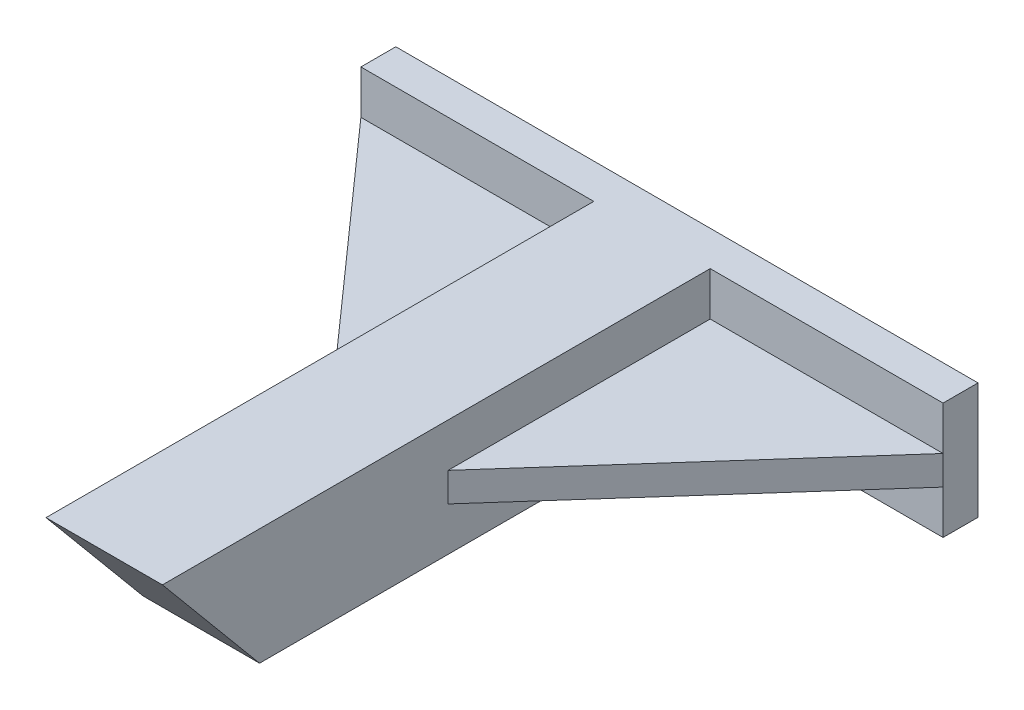
ISO-10303-21;
HEADER;
FILE_DESCRIPTION(('STEP AP214'),'2;1');
FILE_NAME('part.step','',(''),(''),'','','');
FILE_SCHEMA(('AUTOMOTIVE_DESIGN { 1 0 10303 214 1 1 1 1 }'));
ENDSEC;
DATA;
#1=APPLICATION_CONTEXT('core data for automotive mechanical design processes');
#2=APPLICATION_PROTOCOL_DEFINITION('international standard','automotive_design',2000,#1);
#3=PRODUCT_CONTEXT('',#1,'mechanical');
#4=PRODUCT('Part','Part','',(#3));
#5=PRODUCT_RELATED_PRODUCT_CATEGORY('part','',(#4));
#6=PRODUCT_DEFINITION_FORMATION('','',#4);
#7=PRODUCT_DEFINITION_CONTEXT('part definition',#1,'design');
#8=PRODUCT_DEFINITION('design','',#6,#7);
#9=PRODUCT_DEFINITION_SHAPE('','',#8);
#10=(LENGTH_UNIT() NAMED_UNIT(*) SI_UNIT(.MILLI.,.METRE.));
#11=(NAMED_UNIT(*) PLANE_ANGLE_UNIT() SI_UNIT($,.RADIAN.));
#12=(NAMED_UNIT(*) SI_UNIT($,.STERADIAN.) SOLID_ANGLE_UNIT());
#13=UNCERTAINTY_MEASURE_WITH_UNIT(LENGTH_MEASURE(1.E-05),#10,'distance_accuracy_value','');
#14=(GEOMETRIC_REPRESENTATION_CONTEXT(3) GLOBAL_UNCERTAINTY_ASSIGNED_CONTEXT((#13)) GLOBAL_UNIT_ASSIGNED_CONTEXT((#10,
#11,#12)) REPRESENTATION_CONTEXT('',''));
#15=CARTESIAN_POINT('',(0.,0.,0.));
#16=DIRECTION('',(0.,0.,1.));
#17=DIRECTION('',(1.,0.,0.));
#18=AXIS2_PLACEMENT_3D('',#15,#16,#17);
#19=CARTESIAN_POINT('',(-40.,100.,81.));
#20=DIRECTION('',(0.,0.,1.));
#21=DIRECTION('',(1.,0.,0.));
#22=AXIS2_PLACEMENT_3D('',#19,#20,#21);
#23=PLANE('',#22);
#24=DIRECTION('',(0.,1.,0.));
#25=VECTOR('',#24,1.);
#26=CARTESIAN_POINT('',(0.,0.,81.));
#27=LINE('',#26,#25);
#28=CARTESIAN_POINT('',(0.,100.,81.));
#29=VERTEX_POINT('',#28);
#30=CARTESIAN_POINT('',(0.,107.5,81.));
#31=VERTEX_POINT('',#30);
#32=EDGE_CURVE('E11',#29,#31,#27,.T.);
#33=ORIENTED_EDGE('',*,*,#32,.T.);
#34=DIRECTION('',(-1.,0.,0.));
#35=VECTOR('',#34,1.);
#36=CARTESIAN_POINT('',(60.,107.5,81.));
#37=LINE('',#36,#35);
#38=CARTESIAN_POINT('',(-40.,107.5,81.));
#39=VERTEX_POINT('',#38);
#40=EDGE_CURVE('E252',#31,#39,#37,.T.);
#41=ORIENTED_EDGE('',*,*,#40,.T.);
#42=DIRECTION('',(0.,1.,0.));
#43=VECTOR('',#42,1.);
#44=CARTESIAN_POINT('',(-40.,100.,81.));
#45=LINE('',#44,#43);
#46=CARTESIAN_POINT('',(-40.,100.,81.));
#47=VERTEX_POINT('',#46);
#48=EDGE_CURVE('E169',#47,#39,#45,.T.);
#49=ORIENTED_EDGE('',*,*,#48,.F.);
#50=DIRECTION('',(1.,0.,0.));
#51=VECTOR('',#50,1.);
#52=CARTESIAN_POINT('',(-40.,100.,81.));
#53=LINE('',#52,#51);
#54=EDGE_CURVE('E191',#47,#29,#53,.T.);
#55=ORIENTED_EDGE('',*,*,#54,.T.);
#56=EDGE_LOOP('',(#33,#41,#49,#55));
#57=FACE_BOUND('',#56,.T.);
#58=ADVANCED_FACE('F39',(#57),#23,.T.);
#59=DIRECTION('',(0.,1.,0.));
#60=VECTOR('',#59,1.);
#61=CARTESIAN_POINT('',(60.,100.,81.));
#62=LINE('',#61,#60);
#63=CARTESIAN_POINT('',(60.,100.,81.));
#64=VERTEX_POINT('',#63);
#65=CARTESIAN_POINT('',(60.,107.5,81.));
#66=VERTEX_POINT('',#65);
#67=EDGE_CURVE('E208',#64,#66,#62,.T.);
#68=ORIENTED_EDGE('',*,*,#67,.T.);
#69=CARTESIAN_POINT('',(20.,107.5,81.));
#70=VERTEX_POINT('',#69);
#71=EDGE_CURVE('E269',#66,#70,#37,.T.);
#72=ORIENTED_EDGE('',*,*,#71,.T.);
#73=DIRECTION('',(0.,1.,0.));
#74=VECTOR('',#73,1.);
#75=CARTESIAN_POINT('',(20.,0.,81.));
#76=LINE('',#75,#74);
#77=CARTESIAN_POINT('',(20.,100.,81.));
#78=VERTEX_POINT('',#77);
#79=EDGE_CURVE('E212',#78,#70,#76,.T.);
#80=ORIENTED_EDGE('',*,*,#79,.F.);
#81=EDGE_CURVE('E189',#78,#64,#53,.T.);
#82=ORIENTED_EDGE('',*,*,#81,.T.);
#83=EDGE_LOOP('',(#68,#72,#80,#82));
#84=FACE_BOUND('',#83,.T.);
#85=ADVANCED_FACE('F267',(#84),#23,.T.);
#86=CARTESIAN_POINT('',(20.,100.,74.9999999999999));
#87=DIRECTION('',(0.,-1.,0.));
#88=DIRECTION('',(0.,0.,-1.));
#89=AXIS2_PLACEMENT_3D('',#86,#87,#88);
#90=PLANE('',#89);
#91=DIRECTION('',(0.,0.,1.));
#92=VECTOR('',#91,1.);
#93=CARTESIAN_POINT('',(0.,100.,74.9999999999999));
#94=LINE('',#93,#92);
#95=CARTESIAN_POINT('',(0.,100.,158.405049837057));
#96=VERTEX_POINT('',#95);
#97=EDGE_CURVE('E214',#29,#96,#94,.T.);
#98=ORIENTED_EDGE('',*,*,#97,.F.);
#99=ORIENTED_EDGE('',*,*,#54,.F.);
#100=DIRECTION('',(0.,0.,1.));
#101=VECTOR('',#100,1.);
#102=CARTESIAN_POINT('',(-40.,100.,75.));
#103=LINE('',#102,#101);
#104=CARTESIAN_POINT('',(-40.,100.,75.));
#105=VERTEX_POINT('',#104);
#106=EDGE_CURVE('E187',#105,#47,#103,.T.);
#107=ORIENTED_EDGE('',*,*,#106,.F.);
#108=DIRECTION('',(-1.,0.,0.));
#109=VECTOR('',#108,1.);
#110=CARTESIAN_POINT('',(20.,100.,74.9999999999999));
#111=LINE('',#110,#109);
#112=CARTESIAN_POINT('',(60.,100.,75.));
#113=VERTEX_POINT('',#112);
#114=EDGE_CURVE('E231',#113,#105,#111,.T.);
#115=ORIENTED_EDGE('',*,*,#114,.F.);
#116=DIRECTION('',(0.,0.,-1.));
#117=VECTOR('',#116,1.);
#118=CARTESIAN_POINT('',(60.,100.,75.));
#119=LINE('',#118,#117);
#120=EDGE_CURVE('E170',#64,#113,#119,.T.);
#121=ORIENTED_EDGE('',*,*,#120,.F.);
#122=ORIENTED_EDGE('',*,*,#81,.F.);
#123=DIRECTION('',(0.,0.,1.));
#124=VECTOR('',#123,1.);
#125=CARTESIAN_POINT('',(20.,100.,74.9999999999999));
#126=LINE('',#125,#124);
#127=CARTESIAN_POINT('',(20.,100.,158.405049837057));
#128=VERTEX_POINT('',#127);
#129=EDGE_CURVE('E215',#78,#128,#126,.T.);
#130=ORIENTED_EDGE('',*,*,#129,.T.);
#131=DIRECTION('',(-1.,0.,0.));
#132=VECTOR('',#131,1.);
#133=CARTESIAN_POINT('',(20.,100.,158.405049837057));
#134=LINE('',#133,#132);
#135=EDGE_CURVE('E224',#128,#96,#134,.T.);
#136=ORIENTED_EDGE('',*,*,#135,.T.);
#137=EDGE_LOOP('',(#98,#99,#107,#115,#121,#122,#130,#136));
#138=FACE_BOUND('',#137,.T.);
#139=ADVANCED_FACE('F41',(#138),#90,.T.);
#140=CARTESIAN_POINT('',(20.,100.,74.9999999999999));
#141=DIRECTION('',(0.,0.,-1.));
#142=DIRECTION('',(-1.,0.,0.));
#143=AXIS2_PLACEMENT_3D('',#140,#141,#142);
#144=PLANE('',#143);
#145=ORIENTED_EDGE('',*,*,#114,.T.);
#146=DIRECTION('',(0.,1.,0.));
#147=VECTOR('',#146,1.);
#148=CARTESIAN_POINT('',(-40.,100.,75.));
#149=LINE('',#148,#147);
#150=CARTESIAN_POINT('',(-40.,120.,75.));
#151=VERTEX_POINT('',#150);
#152=EDGE_CURVE('E201',#105,#151,#149,.T.);
#153=ORIENTED_EDGE('',*,*,#152,.T.);
#154=DIRECTION('',(-1.,0.,0.));
#155=VECTOR('',#154,1.);
#156=CARTESIAN_POINT('',(20.,120.,74.9999999999999));
#157=LINE('',#156,#155);
#158=CARTESIAN_POINT('',(60.,120.,75.));
#159=VERTEX_POINT('',#158);
#160=EDGE_CURVE('E233',#159,#151,#157,.T.);
#161=ORIENTED_EDGE('',*,*,#160,.F.);
#162=DIRECTION('',(0.,1.,0.));
#163=VECTOR('',#162,1.);
#164=CARTESIAN_POINT('',(60.,100.,75.));
#165=LINE('',#164,#163);
#166=EDGE_CURVE('E205',#113,#159,#165,.T.);
#167=ORIENTED_EDGE('',*,*,#166,.F.);
#168=EDGE_LOOP('',(#145,#153,#161,#167));
#169=FACE_BOUND('',#168,.T.);
#170=ADVANCED_FACE('F256',(#169),#144,.T.);
#171=CARTESIAN_POINT('',(20.,120.,74.9999999999999));
#172=DIRECTION('',(0.,1.,0.));
#173=DIRECTION('',(0.,0.,1.));
#174=AXIS2_PLACEMENT_3D('',#171,#172,#173);
#175=PLANE('',#174);
#176=DIRECTION('',(0.,0.,-1.));
#177=VECTOR('',#176,1.);
#178=CARTESIAN_POINT('',(20.,120.,74.9999999999999));
#179=LINE('',#178,#177);
#180=CARTESIAN_POINT('',(20.,120.,175.086059804468));
#181=VERTEX_POINT('',#180);
#182=CARTESIAN_POINT('',(20.,120.,81.));
#183=VERTEX_POINT('',#182);
#184=EDGE_CURVE('E221',#181,#183,#179,.T.);
#185=ORIENTED_EDGE('',*,*,#184,.T.);
#186=DIRECTION('',(1.,0.,0.));
#187=VECTOR('',#186,1.);
#188=CARTESIAN_POINT('',(-40.,120.,81.));
#189=LINE('',#188,#187);
#190=CARTESIAN_POINT('',(60.,120.,81.));
#191=VERTEX_POINT('',#190);
#192=EDGE_CURVE('E197',#183,#191,#189,.T.);
#193=ORIENTED_EDGE('',*,*,#192,.T.);
#194=DIRECTION('',(0.,0.,-1.));
#195=VECTOR('',#194,1.);
#196=CARTESIAN_POINT('',(60.,120.,75.));
#197=LINE('',#196,#195);
#198=EDGE_CURVE('E190',#191,#159,#197,.T.);
#199=ORIENTED_EDGE('',*,*,#198,.T.);
#200=ORIENTED_EDGE('',*,*,#160,.T.);
#201=DIRECTION('',(0.,0.,1.));
#202=VECTOR('',#201,1.);
#203=CARTESIAN_POINT('',(-40.,120.,75.));
#204=LINE('',#203,#202);
#205=CARTESIAN_POINT('',(-40.,120.,81.));
#206=VERTEX_POINT('',#205);
#207=EDGE_CURVE('E186',#151,#206,#204,.T.);
#208=ORIENTED_EDGE('',*,*,#207,.T.);
#209=CARTESIAN_POINT('',(0.,120.,81.));
#210=VERTEX_POINT('',#209);
#211=EDGE_CURVE('E165',#206,#210,#189,.T.);
#212=ORIENTED_EDGE('',*,*,#211,.T.);
#213=DIRECTION('',(0.,0.,-1.));
#214=VECTOR('',#213,1.);
#215=CARTESIAN_POINT('',(0.,120.,74.9999999999999));
#216=LINE('',#215,#214);
#217=CARTESIAN_POINT('',(0.,120.,175.086059804468));
#218=VERTEX_POINT('',#217);
#219=EDGE_CURVE('E218',#218,#210,#216,.T.);
#220=ORIENTED_EDGE('',*,*,#219,.F.);
#221=DIRECTION('',(-1.,0.,0.));
#222=VECTOR('',#221,1.);
#223=CARTESIAN_POINT('',(20.,120.,175.086059804468));
#224=LINE('',#223,#222);
#225=EDGE_CURVE('E235',#181,#218,#224,.T.);
#226=ORIENTED_EDGE('',*,*,#225,.F.);
#227=EDGE_LOOP('',(#185,#193,#199,#200,#208,#212,#220,#226));
#228=FACE_BOUND('',#227,.T.);
#229=ADVANCED_FACE('F295',(#228),#175,.T.);
#230=CARTESIAN_POINT('',(20.,120.,175.086059804468));
#231=DIRECTION('',(0.,-0.640509373465274,0.767950351587342));
#232=DIRECTION('',(0.,-0.767950351587342,-0.640509373465274));
#233=AXIS2_PLACEMENT_3D('',#230,#231,#232);
#234=PLANE('',#233);
#235=DIRECTION('',(0.,0.767950351587342,0.640509373465274));
#236=VECTOR('',#235,1.);
#237=CARTESIAN_POINT('',(0.,120.,175.086059804468));
#238=LINE('',#237,#236);
#239=EDGE_CURVE('E226',#96,#218,#238,.T.);
#240=ORIENTED_EDGE('',*,*,#239,.F.);
#241=ORIENTED_EDGE('',*,*,#135,.F.);
#242=DIRECTION('',(0.,0.767950351587342,0.640509373465274));
#243=VECTOR('',#242,1.);
#244=CARTESIAN_POINT('',(20.,120.,175.086059804468));
#245=LINE('',#244,#243);
#246=EDGE_CURVE('E217',#128,#181,#245,.T.);
#247=ORIENTED_EDGE('',*,*,#246,.T.);
#248=ORIENTED_EDGE('',*,*,#225,.T.);
#249=EDGE_LOOP('',(#240,#241,#247,#248));
#250=FACE_BOUND('',#249,.T.);
#251=ADVANCED_FACE('F246',(#250),#234,.T.);
#252=CARTESIAN_POINT('',(20.,0.,0.));
#253=DIRECTION('',(-1.,0.,0.));
#254=DIRECTION('',(0.,0.,1.));
#255=AXIS2_PLACEMENT_3D('',#252,#253,#254);
#256=PLANE('',#255);
#257=DIRECTION('',(0.,-1.,0.));
#258=VECTOR('',#257,1.);
#259=CARTESIAN_POINT('',(20.,112.5,126.018077962993));
#260=LINE('',#259,#258);
#261=CARTESIAN_POINT('',(20.,112.5,126.018077962993));
#262=VERTEX_POINT('',#261);
#263=CARTESIAN_POINT('',(20.,107.5,126.018077962993));
#264=VERTEX_POINT('',#263);
#265=EDGE_CURVE('E54',#262,#264,#260,.T.);
#266=ORIENTED_EDGE('',*,*,#265,.F.);
#267=DIRECTION('',(0.,0.,-1.));
#268=VECTOR('',#267,1.);
#269=CARTESIAN_POINT('',(20.,112.5,0.));
#270=LINE('',#269,#268);
#271=CARTESIAN_POINT('',(20.,112.5,81.));
#272=VERTEX_POINT('',#271);
#273=EDGE_CURVE('E184',#262,#272,#270,.T.);
#274=ORIENTED_EDGE('',*,*,#273,.T.);
#275=EDGE_CURVE('E204',#272,#183,#76,.T.);
#276=ORIENTED_EDGE('',*,*,#275,.T.);
#277=ORIENTED_EDGE('',*,*,#184,.F.);
#278=ORIENTED_EDGE('',*,*,#246,.F.);
#279=ORIENTED_EDGE('',*,*,#129,.F.);
#280=ORIENTED_EDGE('',*,*,#79,.T.);
#281=DIRECTION('',(0.,0.,-1.));
#282=VECTOR('',#281,1.);
#283=CARTESIAN_POINT('',(20.,107.5,0.));
#284=LINE('',#283,#282);
#285=EDGE_CURVE('E59',#264,#70,#284,.T.);
#286=ORIENTED_EDGE('',*,*,#285,.F.);
#287=EDGE_LOOP('',(#266,#274,#276,#277,#278,#279,#280,#286));
#288=FACE_BOUND('',#287,.T.);
#289=ADVANCED_FACE('F288',(#288),#256,.F.);
#290=CARTESIAN_POINT('',(0.,0.,0.));
#291=DIRECTION('',(-1.,0.,0.));
#292=DIRECTION('',(0.,0.,1.));
#293=AXIS2_PLACEMENT_3D('',#290,#291,#292);
#294=PLANE('',#293);
#295=DIRECTION('',(0.,0.,-1.));
#296=VECTOR('',#295,1.);
#297=CARTESIAN_POINT('',(0.,112.5,0.));
#298=LINE('',#297,#296);
#299=CARTESIAN_POINT('',(0.,112.5,126.018077962993));
#300=VERTEX_POINT('',#299);
#301=CARTESIAN_POINT('',(0.,112.5,81.));
#302=VERTEX_POINT('',#301);
#303=EDGE_CURVE('E144',#300,#302,#298,.T.);
#304=ORIENTED_EDGE('',*,*,#303,.F.);
#305=DIRECTION('',(0.,-1.,0.));
#306=VECTOR('',#305,1.);
#307=CARTESIAN_POINT('',(0.,112.5,126.018077962993));
#308=LINE('',#307,#306);
#309=CARTESIAN_POINT('',(0.,107.5,126.018077962993));
#310=VERTEX_POINT('',#309);
#311=EDGE_CURVE('E158',#300,#310,#308,.T.);
#312=ORIENTED_EDGE('',*,*,#311,.T.);
#313=DIRECTION('',(0.,0.,-1.));
#314=VECTOR('',#313,1.);
#315=CARTESIAN_POINT('',(0.,107.5,0.));
#316=LINE('',#315,#314);
#317=EDGE_CURVE('E175',#310,#31,#316,.T.);
#318=ORIENTED_EDGE('',*,*,#317,.T.);
#319=ORIENTED_EDGE('',*,*,#32,.F.);
#320=ORIENTED_EDGE('',*,*,#97,.T.);
#321=ORIENTED_EDGE('',*,*,#239,.T.);
#322=ORIENTED_EDGE('',*,*,#219,.T.);
#323=EDGE_CURVE('E47',#302,#210,#27,.T.);
#324=ORIENTED_EDGE('',*,*,#323,.F.);
#325=EDGE_LOOP('',(#304,#312,#318,#319,#320,#321,#322,#324));
#326=FACE_BOUND('',#325,.T.);
#327=ADVANCED_FACE('F249',(#326),#294,.T.);
#328=CARTESIAN_POINT('',(-40.,100.,75.));
#329=DIRECTION('',(-1.,0.,0.));
#330=DIRECTION('',(0.,0.,1.));
#331=AXIS2_PLACEMENT_3D('',#328,#329,#330);
#332=PLANE('',#331);
#333=ORIENTED_EDGE('',*,*,#207,.F.);
#334=ORIENTED_EDGE('',*,*,#152,.F.);
#335=ORIENTED_EDGE('',*,*,#106,.T.);
#336=ORIENTED_EDGE('',*,*,#48,.T.);
#337=DIRECTION('',(0.,-1.,0.));
#338=VECTOR('',#337,1.);
#339=CARTESIAN_POINT('',(-40.,112.5,81.));
#340=LINE('',#339,#338);
#341=CARTESIAN_POINT('',(-40.,112.5,81.));
#342=VERTEX_POINT('',#341);
#343=EDGE_CURVE('E155',#342,#39,#340,.T.);
#344=ORIENTED_EDGE('',*,*,#343,.F.);
#345=EDGE_CURVE('E162',#342,#206,#45,.T.);
#346=ORIENTED_EDGE('',*,*,#345,.T.);
#347=EDGE_LOOP('',(#333,#334,#335,#336,#344,#346));
#348=FACE_BOUND('',#347,.T.);
#349=ADVANCED_FACE('F173',(#348),#332,.T.);
#350=DIRECTION('',(-1.,0.,0.));
#351=VECTOR('',#350,1.);
#352=CARTESIAN_POINT('',(60.,112.5,81.));
#353=LINE('',#352,#351);
#354=EDGE_CURVE('E138',#302,#342,#353,.T.);
#355=ORIENTED_EDGE('',*,*,#354,.F.);
#356=ORIENTED_EDGE('',*,*,#323,.T.);
#357=ORIENTED_EDGE('',*,*,#211,.F.);
#358=ORIENTED_EDGE('',*,*,#345,.F.);
#359=EDGE_LOOP('',(#355,#356,#357,#358));
#360=FACE_BOUND('',#359,.T.);
#361=ADVANCED_FACE('F163',(#360),#23,.T.);
#362=CARTESIAN_POINT('',(60.,112.5,81.));
#363=VERTEX_POINT('',#362);
#364=EDGE_CURVE('E148',#363,#272,#353,.T.);
#365=ORIENTED_EDGE('',*,*,#364,.F.);
#366=EDGE_CURVE('E210',#363,#191,#62,.T.);
#367=ORIENTED_EDGE('',*,*,#366,.T.);
#368=ORIENTED_EDGE('',*,*,#192,.F.);
#369=ORIENTED_EDGE('',*,*,#275,.F.);
#370=EDGE_LOOP('',(#365,#367,#368,#369));
#371=FACE_BOUND('',#370,.T.);
#372=ADVANCED_FACE('F292',(#371),#23,.T.);
#373=CARTESIAN_POINT('',(60.,100.,75.));
#374=DIRECTION('',(1.,0.,0.));
#375=DIRECTION('',(0.,0.,-1.));
#376=AXIS2_PLACEMENT_3D('',#373,#374,#375);
#377=PLANE('',#376);
#378=ORIENTED_EDGE('',*,*,#198,.F.);
#379=ORIENTED_EDGE('',*,*,#366,.F.);
#380=DIRECTION('',(0.,-1.,0.));
#381=VECTOR('',#380,1.);
#382=CARTESIAN_POINT('',(60.,112.5,81.));
#383=LINE('',#382,#381);
#384=EDGE_CURVE('E264',#363,#66,#383,.T.);
#385=ORIENTED_EDGE('',*,*,#384,.T.);
#386=ORIENTED_EDGE('',*,*,#67,.F.);
#387=ORIENTED_EDGE('',*,*,#120,.T.);
#388=ORIENTED_EDGE('',*,*,#166,.T.);
#389=EDGE_LOOP('',(#378,#379,#385,#386,#387,#388));
#390=FACE_BOUND('',#389,.T.);
#391=ADVANCED_FACE('F262',(#390),#377,.T.);
#392=CARTESIAN_POINT('',(20.,112.5,126.018077962993));
#393=DIRECTION('',(-0.747541802025906,0.,-0.66421476513539));
#394=DIRECTION('',(-0.66421476513539,0.,0.747541802025906));
#395=AXIS2_PLACEMENT_3D('',#392,#393,#394);
#396=PLANE('',#395);
#397=DIRECTION('',(0.66421476513539,0.,-0.747541802025906));
#398=VECTOR('',#397,1.);
#399=CARTESIAN_POINT('',(20.,107.5,126.018077962993));
#400=LINE('',#399,#398);
#401=EDGE_CURVE('E149',#264,#66,#400,.T.);
#402=ORIENTED_EDGE('',*,*,#401,.T.);
#403=ORIENTED_EDGE('',*,*,#384,.F.);
#404=DIRECTION('',(0.66421476513539,0.,-0.747541802025906));
#405=VECTOR('',#404,1.);
#406=CARTESIAN_POINT('',(20.,112.5,126.018077962993));
#407=LINE('',#406,#405);
#408=EDGE_CURVE('E159',#262,#363,#407,.T.);
#409=ORIENTED_EDGE('',*,*,#408,.F.);
#410=ORIENTED_EDGE('',*,*,#265,.T.);
#411=EDGE_LOOP('',(#402,#403,#409,#410));
#412=FACE_BOUND('',#411,.T.);
#413=ADVANCED_FACE('F272',(#412),#396,.F.);
#414=CARTESIAN_POINT('',(0.,107.5,0.));
#415=DIRECTION('',(0.,1.,0.));
#416=DIRECTION('',(0.,0.,1.));
#417=AXIS2_PLACEMENT_3D('',#414,#415,#416);
#418=PLANE('',#417);
#419=ORIENTED_EDGE('',*,*,#401,.F.);
#420=ORIENTED_EDGE('',*,*,#285,.T.);
#421=ORIENTED_EDGE('',*,*,#71,.F.);
#422=EDGE_LOOP('',(#419,#420,#421));
#423=FACE_BOUND('',#422,.T.);
#424=ADVANCED_FACE('F277',(#423),#418,.F.);
#425=CARTESIAN_POINT('',(0.,112.5,0.));
#426=DIRECTION('',(0.,1.,0.));
#427=DIRECTION('',(0.,0.,1.));
#428=AXIS2_PLACEMENT_3D('',#425,#426,#427);
#429=PLANE('',#428);
#430=ORIENTED_EDGE('',*,*,#273,.F.);
#431=ORIENTED_EDGE('',*,*,#408,.T.);
#432=ORIENTED_EDGE('',*,*,#364,.T.);
#433=EDGE_LOOP('',(#430,#431,#432));
#434=FACE_BOUND('',#433,.T.);
#435=ADVANCED_FACE('F285',(#434),#429,.T.);
#436=CARTESIAN_POINT('',(-40.,112.5,81.));
#437=DIRECTION('',(0.747541802025906,0.,-0.66421476513539));
#438=DIRECTION('',(-0.66421476513539,0.,-0.747541802025906));
#439=AXIS2_PLACEMENT_3D('',#436,#437,#438);
#440=PLANE('',#439);
#441=DIRECTION('',(0.66421476513539,0.,0.747541802025906));
#442=VECTOR('',#441,1.);
#443=CARTESIAN_POINT('',(-40.,107.5,81.));
#444=LINE('',#443,#442);
#445=EDGE_CURVE('E275',#39,#310,#444,.T.);
#446=ORIENTED_EDGE('',*,*,#445,.T.);
#447=ORIENTED_EDGE('',*,*,#311,.F.);
#448=DIRECTION('',(0.66421476513539,0.,0.747541802025906));
#449=VECTOR('',#448,1.);
#450=CARTESIAN_POINT('',(-40.,112.5,81.));
#451=LINE('',#450,#449);
#452=EDGE_CURVE('E141',#342,#300,#451,.T.);
#453=ORIENTED_EDGE('',*,*,#452,.F.);
#454=ORIENTED_EDGE('',*,*,#343,.T.);
#455=EDGE_LOOP('',(#446,#447,#453,#454));
#456=FACE_BOUND('',#455,.T.);
#457=ADVANCED_FACE('F153',(#456),#440,.F.);
#458=ORIENTED_EDGE('',*,*,#452,.T.);
#459=ORIENTED_EDGE('',*,*,#303,.T.);
#460=ORIENTED_EDGE('',*,*,#354,.T.);
#461=EDGE_LOOP('',(#458,#459,#460));
#462=FACE_BOUND('',#461,.T.);
#463=ADVANCED_FACE('F140',(#462),#429,.T.);
#464=ORIENTED_EDGE('',*,*,#317,.F.);
#465=ORIENTED_EDGE('',*,*,#445,.F.);
#466=ORIENTED_EDGE('',*,*,#40,.F.);
#467=EDGE_LOOP('',(#464,#465,#466));
#468=FACE_BOUND('',#467,.T.);
#469=ADVANCED_FACE('F402',(#468),#418,.F.);
#470=CLOSED_SHELL('',(#58,#85,#139,#170,#229,#251,#289,#327,#349,#361,#372,#391,#413,#424,#435,
#457,#463,#469));
#471=MANIFOLD_SOLID_BREP('B2',#470);
#472=ADVANCED_BREP_SHAPE_REPRESENTATION('',(#18,#471),#14);
#473=SHAPE_DEFINITION_REPRESENTATION(#9,#472);
ENDSEC;
END-ISO-10303-21;
